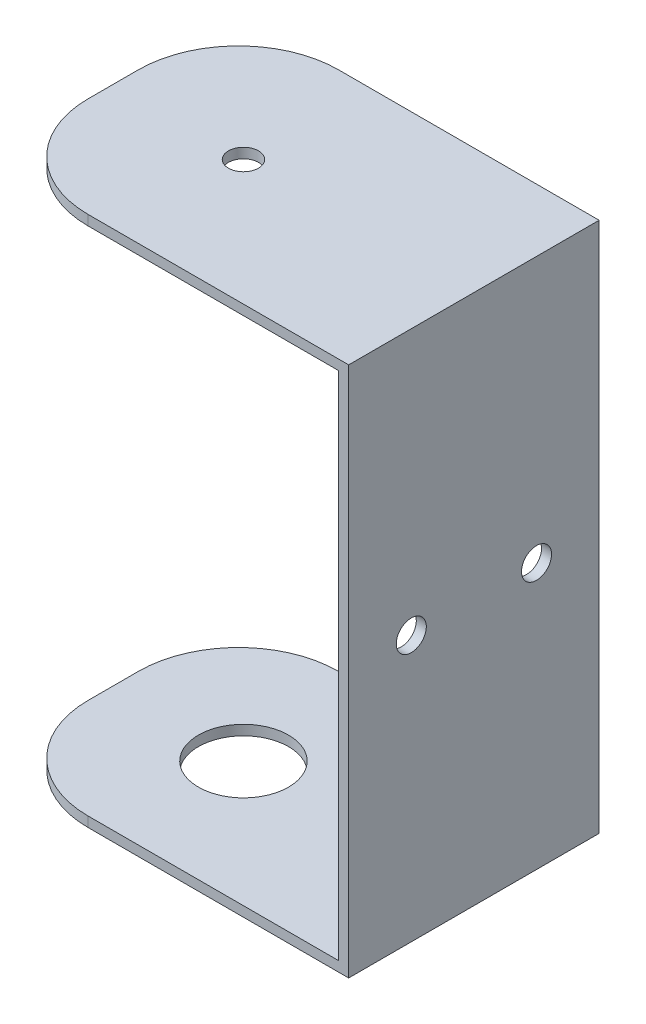
ISO-10303-21;
HEADER;
FILE_DESCRIPTION(('STEP AP214'),'2;1');
FILE_NAME('part.step','',(''),(''),'','','');
FILE_SCHEMA(('AUTOMOTIVE_DESIGN { 1 0 10303 214 1 1 1 1 }'));
ENDSEC;
DATA;
#1=APPLICATION_CONTEXT('core data for automotive mechanical design processes');
#2=APPLICATION_PROTOCOL_DEFINITION('international standard','automotive_design',2000,#1);
#3=PRODUCT_CONTEXT('',#1,'mechanical');
#4=PRODUCT('Part','Part','',(#3));
#5=PRODUCT_RELATED_PRODUCT_CATEGORY('part','',(#4));
#6=PRODUCT_DEFINITION_FORMATION('','',#4);
#7=PRODUCT_DEFINITION_CONTEXT('part definition',#1,'design');
#8=PRODUCT_DEFINITION('design','',#6,#7);
#9=PRODUCT_DEFINITION_SHAPE('','',#8);
#10=(LENGTH_UNIT() NAMED_UNIT(*) SI_UNIT(.MILLI.,.METRE.));
#11=(NAMED_UNIT(*) PLANE_ANGLE_UNIT() SI_UNIT($,.RADIAN.));
#12=(NAMED_UNIT(*) SI_UNIT($,.STERADIAN.) SOLID_ANGLE_UNIT());
#13=UNCERTAINTY_MEASURE_WITH_UNIT(LENGTH_MEASURE(1.E-05),#10,'distance_accuracy_value','');
#14=(GEOMETRIC_REPRESENTATION_CONTEXT(3) GLOBAL_UNCERTAINTY_ASSIGNED_CONTEXT((#13)) GLOBAL_UNIT_ASSIGNED_CONTEXT((#10,
#11,#12)) REPRESENTATION_CONTEXT('',''));
#15=CARTESIAN_POINT('',(0.,0.,0.));
#16=DIRECTION('',(0.,0.,1.));
#17=DIRECTION('',(1.,0.,0.));
#18=AXIS2_PLACEMENT_3D('',#15,#16,#17);
#19=CARTESIAN_POINT('',(0.,16.1492832575977,25.));
#20=DIRECTION('',(0.,-1.,0.));
#21=DIRECTION('',(1.,0.,0.));
#22=AXIS2_PLACEMENT_3D('',#19,#20,#21);
#23=PLANE('',#22);
#24=CARTESIAN_POINT('',(-22.,16.1492832575977,12.5));
#25=DIRECTION('',(0.,1.,0.));
#26=DIRECTION('',(-1.,0.,0.));
#27=AXIS2_PLACEMENT_3D('',#24,#25,#26);
#28=CIRCLE('',#27,1.5);
#29=CARTESIAN_POINT('',(-23.5,16.1492832575977,12.5));
#30=VERTEX_POINT('',#29);
#31=EDGE_CURVE('E272',#30,#30,#28,.T.);
#32=ORIENTED_EDGE('',*,*,#31,.F.);
#33=EDGE_LOOP('',(#32));
#34=FACE_BOUND('',#33,.T.);
#35=DIRECTION('',(0.,0.,-1.));
#36=VECTOR('',#35,1.);
#37=CARTESIAN_POINT('',(-35.,16.1492832575977,25.));
#38=LINE('',#37,#36);
#39=CARTESIAN_POINT('',(-35.,16.1492832575977,15.));
#40=VERTEX_POINT('',#39);
#41=CARTESIAN_POINT('',(-35.,16.1492832575977,10.));
#42=VERTEX_POINT('',#41);
#43=EDGE_CURVE('E183',#40,#42,#38,.T.);
#44=ORIENTED_EDGE('',*,*,#43,.F.);
#45=CARTESIAN_POINT('',(-25.,16.1492832575977,15.));
#46=DIRECTION('',(0.,-1.,0.));
#47=DIRECTION('',(1.,0.,0.));
#48=AXIS2_PLACEMENT_3D('',#45,#46,#47);
#49=CIRCLE('',#48,10.);
#50=CARTESIAN_POINT('',(-25.,16.1492832575977,25.));
#51=VERTEX_POINT('',#50);
#52=EDGE_CURVE('E193',#40,#51,#49,.F.);
#53=ORIENTED_EDGE('',*,*,#52,.T.);
#54=DIRECTION('',(-1.,0.,0.));
#55=VECTOR('',#54,1.);
#56=CARTESIAN_POINT('',(0.,16.1492832575977,25.));
#57=LINE('',#56,#55);
#58=CARTESIAN_POINT('',(1.,16.1492832575977,25.));
#59=VERTEX_POINT('',#58);
#60=EDGE_CURVE('E143',#59,#51,#57,.T.);
#61=ORIENTED_EDGE('',*,*,#60,.F.);
#62=DIRECTION('',(0.,0.,-1.));
#63=VECTOR('',#62,1.);
#64=CARTESIAN_POINT('',(1.,16.1492832575977,25.));
#65=LINE('',#64,#63);
#66=CARTESIAN_POINT('',(1.,16.1492832575977,0.));
#67=VERTEX_POINT('',#66);
#68=EDGE_CURVE('E157',#59,#67,#65,.T.);
#69=ORIENTED_EDGE('',*,*,#68,.T.);
#70=DIRECTION('',(-1.,0.,0.));
#71=VECTOR('',#70,1.);
#72=CARTESIAN_POINT('',(0.,16.1492832575977,0.));
#73=LINE('',#72,#71);
#74=CARTESIAN_POINT('',(-25.,16.1492832575977,0.));
#75=VERTEX_POINT('',#74);
#76=EDGE_CURVE('E158',#67,#75,#73,.T.);
#77=ORIENTED_EDGE('',*,*,#76,.T.);
#78=CARTESIAN_POINT('',(-25.,16.1492832575977,10.));
#79=DIRECTION('',(0.,-1.,0.));
#80=DIRECTION('',(1.,0.,0.));
#81=AXIS2_PLACEMENT_3D('',#78,#79,#80);
#82=CIRCLE('',#81,10.);
#83=EDGE_CURVE('E191',#75,#42,#82,.F.);
#84=ORIENTED_EDGE('',*,*,#83,.T.);
#85=EDGE_LOOP('',(#44,#53,#61,#69,#77,#84));
#86=FACE_BOUND('',#85,.T.);
#87=ADVANCED_FACE('F32',(#34,#86),#23,.F.);
#88=CARTESIAN_POINT('',(-35.,15.1492832575977,25.));
#89=DIRECTION('',(-1.,0.,0.));
#90=DIRECTION('',(0.,0.,1.));
#91=AXIS2_PLACEMENT_3D('',#88,#89,#90);
#92=PLANE('',#91);
#93=DIRECTION('',(0.,0.,-1.));
#94=VECTOR('',#93,1.);
#95=CARTESIAN_POINT('',(-35.,15.1492832575977,25.));
#96=LINE('',#95,#94);
#97=CARTESIAN_POINT('',(-35.,15.1492832575977,15.));
#98=VERTEX_POINT('',#97);
#99=CARTESIAN_POINT('',(-35.,15.1492832575977,10.));
#100=VERTEX_POINT('',#99);
#101=EDGE_CURVE('E132',#98,#100,#96,.T.);
#102=ORIENTED_EDGE('',*,*,#101,.F.);
#103=DIRECTION('',(0.,1.,0.));
#104=VECTOR('',#103,1.);
#105=CARTESIAN_POINT('',(-35.,16.1492832575977,15.));
#106=LINE('',#105,#104);
#107=EDGE_CURVE('E188',#98,#40,#106,.T.);
#108=ORIENTED_EDGE('',*,*,#107,.T.);
#109=ORIENTED_EDGE('',*,*,#43,.T.);
#110=DIRECTION('',(0.,1.,0.));
#111=VECTOR('',#110,1.);
#112=CARTESIAN_POINT('',(-35.,15.1492832575977,10.));
#113=LINE('',#112,#111);
#114=EDGE_CURVE('E186',#42,#100,#113,.F.);
#115=ORIENTED_EDGE('',*,*,#114,.T.);
#116=EDGE_LOOP('',(#102,#108,#109,#115));
#117=FACE_BOUND('',#116,.T.);
#118=ADVANCED_FACE('F245',(#117),#92,.T.);
#119=CARTESIAN_POINT('',(0.,15.1492832575977,25.));
#120=DIRECTION('',(0.,-1.,0.));
#121=DIRECTION('',(1.,0.,0.));
#122=AXIS2_PLACEMENT_3D('',#119,#120,#121);
#123=PLANE('',#122);
#124=CARTESIAN_POINT('',(-22.,15.1492832575977,12.5));
#125=DIRECTION('',(0.,1.,0.));
#126=DIRECTION('',(-1.,0.,0.));
#127=AXIS2_PLACEMENT_3D('',#124,#125,#126);
#128=CIRCLE('',#127,1.5);
#129=CARTESIAN_POINT('',(-23.5,15.1492832575977,12.5));
#130=VERTEX_POINT('',#129);
#131=EDGE_CURVE('E161',#130,#130,#128,.T.);
#132=ORIENTED_EDGE('',*,*,#131,.T.);
#133=EDGE_LOOP('',(#132));
#134=FACE_BOUND('',#133,.T.);
#135=DIRECTION('',(-1.,0.,0.));
#136=VECTOR('',#135,1.);
#137=CARTESIAN_POINT('',(0.,15.1492832575977,25.));
#138=LINE('',#137,#136);
#139=CARTESIAN_POINT('',(0.,15.1492832575977,25.));
#140=VERTEX_POINT('',#139);
#141=CARTESIAN_POINT('',(-25.,15.1492832575977,25.));
#142=VERTEX_POINT('',#141);
#143=EDGE_CURVE('E124',#140,#142,#138,.T.);
#144=ORIENTED_EDGE('',*,*,#143,.T.);
#145=CARTESIAN_POINT('',(-25.,15.1492832575977,15.));
#146=DIRECTION('',(0.,-1.,0.));
#147=DIRECTION('',(1.,0.,0.));
#148=AXIS2_PLACEMENT_3D('',#145,#146,#147);
#149=CIRCLE('',#148,10.);
#150=EDGE_CURVE('E200',#142,#98,#149,.T.);
#151=ORIENTED_EDGE('',*,*,#150,.T.);
#152=ORIENTED_EDGE('',*,*,#101,.T.);
#153=CARTESIAN_POINT('',(-25.,15.1492832575977,10.));
#154=DIRECTION('',(0.,-1.,0.));
#155=DIRECTION('',(1.,0.,0.));
#156=AXIS2_PLACEMENT_3D('',#153,#154,#155);
#157=CIRCLE('',#156,10.);
#158=CARTESIAN_POINT('',(-25.,15.1492832575977,0.));
#159=VERTEX_POINT('',#158);
#160=EDGE_CURVE('E198',#100,#159,#157,.T.);
#161=ORIENTED_EDGE('',*,*,#160,.T.);
#162=DIRECTION('',(-1.,0.,0.));
#163=VECTOR('',#162,1.);
#164=CARTESIAN_POINT('',(0.,15.1492832575977,0.));
#165=LINE('',#164,#163);
#166=CARTESIAN_POINT('',(0.,15.1492832575977,0.));
#167=VERTEX_POINT('',#166);
#168=EDGE_CURVE('E127',#167,#159,#165,.T.);
#169=ORIENTED_EDGE('',*,*,#168,.F.);
#170=DIRECTION('',(0.,0.,-1.));
#171=VECTOR('',#170,1.);
#172=CARTESIAN_POINT('',(0.,15.1492832575977,25.));
#173=LINE('',#172,#171);
#174=EDGE_CURVE('E121',#140,#167,#173,.T.);
#175=ORIENTED_EDGE('',*,*,#174,.F.);
#176=EDGE_LOOP('',(#144,#151,#152,#161,#169,#175));
#177=FACE_BOUND('',#176,.T.);
#178=ADVANCED_FACE('F123',(#134,#177),#123,.T.);
#179=CARTESIAN_POINT('',(0.,15.1492832575977,25.));
#180=DIRECTION('',(-1.,0.,0.));
#181=DIRECTION('',(0.,-1.,0.));
#182=AXIS2_PLACEMENT_3D('',#179,#180,#181);
#183=PLANE('',#182);
#184=CARTESIAN_POINT('',(0.,-10.3507167424023,18.75));
#185=DIRECTION('',(1.,0.,0.));
#186=DIRECTION('',(0.,1.,0.));
#187=AXIS2_PLACEMENT_3D('',#184,#185,#186);
#188=CIRCLE('',#187,1.5);
#189=CARTESIAN_POINT('',(0.,-8.85071674240226,18.75));
#190=VERTEX_POINT('',#189);
#191=EDGE_CURVE('E287',#190,#190,#188,.T.);
#192=ORIENTED_EDGE('',*,*,#191,.T.);
#193=EDGE_LOOP('',(#192));
#194=FACE_BOUND('',#193,.T.);
#195=CARTESIAN_POINT('',(0.,-10.3507167424023,6.25));
#196=DIRECTION('',(1.,0.,0.));
#197=DIRECTION('',(0.,1.,0.));
#198=AXIS2_PLACEMENT_3D('',#195,#196,#197);
#199=CIRCLE('',#198,1.5);
#200=CARTESIAN_POINT('',(0.,-8.85071674240226,6.25));
#201=VERTEX_POINT('',#200);
#202=EDGE_CURVE('E281',#201,#201,#199,.T.);
#203=ORIENTED_EDGE('',*,*,#202,.T.);
#204=EDGE_LOOP('',(#203));
#205=FACE_BOUND('',#204,.T.);
#206=DIRECTION('',(0.,1.,0.));
#207=VECTOR('',#206,1.);
#208=CARTESIAN_POINT('',(0.,15.1492832575977,0.));
#209=LINE('',#208,#207);
#210=CARTESIAN_POINT('',(0.,-35.8507167424023,0.));
#211=VERTEX_POINT('',#210);
#212=EDGE_CURVE('E163',#211,#167,#209,.T.);
#213=ORIENTED_EDGE('',*,*,#212,.F.);
#214=DIRECTION('',(0.,0.,-1.));
#215=VECTOR('',#214,1.);
#216=CARTESIAN_POINT('',(0.,-35.8507167424023,25.));
#217=LINE('',#216,#215);
#218=CARTESIAN_POINT('',(0.,-35.8507167424023,25.));
#219=VERTEX_POINT('',#218);
#220=EDGE_CURVE('E133',#219,#211,#217,.T.);
#221=ORIENTED_EDGE('',*,*,#220,.F.);
#222=DIRECTION('',(0.,1.,0.));
#223=VECTOR('',#222,1.);
#224=CARTESIAN_POINT('',(0.,15.1492832575977,25.));
#225=LINE('',#224,#223);
#226=EDGE_CURVE('E140',#219,#140,#225,.T.);
#227=ORIENTED_EDGE('',*,*,#226,.T.);
#228=ORIENTED_EDGE('',*,*,#174,.T.);
#229=EDGE_LOOP('',(#213,#221,#227,#228));
#230=FACE_BOUND('',#229,.T.);
#231=ADVANCED_FACE('F146',(#194,#205,#230),#183,.T.);
#232=CARTESIAN_POINT('',(0.,-35.8507167424023,25.));
#233=DIRECTION('',(0.,1.,0.));
#234=DIRECTION('',(-1.,0.,0.));
#235=AXIS2_PLACEMENT_3D('',#232,#233,#234);
#236=PLANE('',#235);
#237=CARTESIAN_POINT('',(-22.,-35.8507167424023,12.5));
#238=DIRECTION('',(0.,-1.,0.));
#239=DIRECTION('',(1.,0.,0.));
#240=AXIS2_PLACEMENT_3D('',#237,#238,#239);
#241=CIRCLE('',#240,4.5);
#242=CARTESIAN_POINT('',(-17.5,-35.8507167424023,12.5));
#243=VERTEX_POINT('',#242);
#244=EDGE_CURVE('E275',#243,#243,#241,.T.);
#245=ORIENTED_EDGE('',*,*,#244,.T.);
#246=EDGE_LOOP('',(#245));
#247=FACE_BOUND('',#246,.T.);
#248=DIRECTION('',(1.,0.,0.));
#249=VECTOR('',#248,1.);
#250=CARTESIAN_POINT('',(0.,-35.8507167424023,0.));
#251=LINE('',#250,#249);
#252=CARTESIAN_POINT('',(-25.,-35.8507167424023,0.));
#253=VERTEX_POINT('',#252);
#254=EDGE_CURVE('E165',#253,#211,#251,.T.);
#255=ORIENTED_EDGE('',*,*,#254,.F.);
#256=CARTESIAN_POINT('',(-25.,-35.8507167424023,10.));
#257=DIRECTION('',(0.,1.,0.));
#258=DIRECTION('',(-1.,0.,0.));
#259=AXIS2_PLACEMENT_3D('',#256,#257,#258);
#260=CIRCLE('',#259,10.);
#261=CARTESIAN_POINT('',(-35.,-35.8507167424023,10.));
#262=VERTEX_POINT('',#261);
#263=EDGE_CURVE('E210',#253,#262,#260,.T.);
#264=ORIENTED_EDGE('',*,*,#263,.T.);
#265=DIRECTION('',(0.,0.,-1.));
#266=VECTOR('',#265,1.);
#267=CARTESIAN_POINT('',(-35.,-35.8507167424023,25.));
#268=LINE('',#267,#266);
#269=CARTESIAN_POINT('',(-35.,-35.8507167424023,15.));
#270=VERTEX_POINT('',#269);
#271=EDGE_CURVE('E178',#270,#262,#268,.T.);
#272=ORIENTED_EDGE('',*,*,#271,.F.);
#273=CARTESIAN_POINT('',(-25.,-35.8507167424023,15.));
#274=DIRECTION('',(0.,1.,0.));
#275=DIRECTION('',(-1.,0.,0.));
#276=AXIS2_PLACEMENT_3D('',#273,#274,#275);
#277=CIRCLE('',#276,10.);
#278=CARTESIAN_POINT('',(-25.,-35.8507167424023,25.));
#279=VERTEX_POINT('',#278);
#280=EDGE_CURVE('E208',#270,#279,#277,.T.);
#281=ORIENTED_EDGE('',*,*,#280,.T.);
#282=DIRECTION('',(1.,0.,0.));
#283=VECTOR('',#282,1.);
#284=CARTESIAN_POINT('',(0.,-35.8507167424023,25.));
#285=LINE('',#284,#283);
#286=EDGE_CURVE('E148',#279,#219,#285,.T.);
#287=ORIENTED_EDGE('',*,*,#286,.T.);
#288=ORIENTED_EDGE('',*,*,#220,.T.);
#289=EDGE_LOOP('',(#255,#264,#272,#281,#287,#288));
#290=FACE_BOUND('',#289,.T.);
#291=ADVANCED_FACE('F221',(#247,#290),#236,.T.);
#292=CARTESIAN_POINT('',(-35.,-36.8507167424023,25.));
#293=DIRECTION('',(-1.,0.,0.));
#294=DIRECTION('',(0.,0.,1.));
#295=AXIS2_PLACEMENT_3D('',#292,#293,#294);
#296=PLANE('',#295);
#297=ORIENTED_EDGE('',*,*,#271,.T.);
#298=DIRECTION('',(0.,1.,0.));
#299=VECTOR('',#298,1.);
#300=CARTESIAN_POINT('',(-35.,-36.8507167424023,10.));
#301=LINE('',#300,#299);
#302=CARTESIAN_POINT('',(-35.,-36.8507167424023,10.));
#303=VERTEX_POINT('',#302);
#304=EDGE_CURVE('E47',#262,#303,#301,.F.);
#305=ORIENTED_EDGE('',*,*,#304,.T.);
#306=DIRECTION('',(0.,0.,-1.));
#307=VECTOR('',#306,1.);
#308=CARTESIAN_POINT('',(-35.,-36.8507167424023,25.));
#309=LINE('',#308,#307);
#310=CARTESIAN_POINT('',(-35.,-36.8507167424023,15.));
#311=VERTEX_POINT('',#310);
#312=EDGE_CURVE('E176',#311,#303,#309,.T.);
#313=ORIENTED_EDGE('',*,*,#312,.F.);
#314=DIRECTION('',(0.,1.,0.));
#315=VECTOR('',#314,1.);
#316=CARTESIAN_POINT('',(-35.,-35.8507167424023,15.));
#317=LINE('',#316,#315);
#318=EDGE_CURVE('E212',#311,#270,#317,.T.);
#319=ORIENTED_EDGE('',*,*,#318,.T.);
#320=EDGE_LOOP('',(#297,#305,#313,#319));
#321=FACE_BOUND('',#320,.T.);
#322=ADVANCED_FACE('F217',(#321),#296,.T.);
#323=CARTESIAN_POINT('',(0.,-36.8507167424023,25.));
#324=DIRECTION('',(0.,1.,0.));
#325=DIRECTION('',(-1.,0.,0.));
#326=AXIS2_PLACEMENT_3D('',#323,#324,#325);
#327=PLANE('',#326);
#328=CARTESIAN_POINT('',(-22.,-36.8507167424023,12.5));
#329=DIRECTION('',(0.,-1.,0.));
#330=DIRECTION('',(1.,0.,0.));
#331=AXIS2_PLACEMENT_3D('',#328,#329,#330);
#332=CIRCLE('',#331,4.5);
#333=CARTESIAN_POINT('',(-17.5,-36.8507167424023,12.5));
#334=VERTEX_POINT('',#333);
#335=EDGE_CURVE('E278',#334,#334,#332,.T.);
#336=ORIENTED_EDGE('',*,*,#335,.F.);
#337=EDGE_LOOP('',(#336));
#338=FACE_BOUND('',#337,.T.);
#339=ORIENTED_EDGE('',*,*,#312,.T.);
#340=CARTESIAN_POINT('',(-25.,-36.8507167424023,10.));
#341=DIRECTION('',(0.,1.,0.));
#342=DIRECTION('',(-1.,0.,0.));
#343=AXIS2_PLACEMENT_3D('',#340,#341,#342);
#344=CIRCLE('',#343,10.);
#345=CARTESIAN_POINT('',(-25.,-36.8507167424023,0.));
#346=VERTEX_POINT('',#345);
#347=EDGE_CURVE('E11',#303,#346,#344,.F.);
#348=ORIENTED_EDGE('',*,*,#347,.T.);
#349=DIRECTION('',(1.,0.,0.));
#350=VECTOR('',#349,1.);
#351=CARTESIAN_POINT('',(0.,-36.8507167424023,0.));
#352=LINE('',#351,#350);
#353=CARTESIAN_POINT('',(1.,-36.8507167424023,0.));
#354=VERTEX_POINT('',#353);
#355=EDGE_CURVE('E167',#346,#354,#352,.T.);
#356=ORIENTED_EDGE('',*,*,#355,.T.);
#357=DIRECTION('',(0.,0.,-1.));
#358=VECTOR('',#357,1.);
#359=CARTESIAN_POINT('',(1.,-36.8507167424023,25.));
#360=LINE('',#359,#358);
#361=CARTESIAN_POINT('',(1.,-36.8507167424023,25.));
#362=VERTEX_POINT('',#361);
#363=EDGE_CURVE('E173',#362,#354,#360,.T.);
#364=ORIENTED_EDGE('',*,*,#363,.F.);
#365=DIRECTION('',(1.,0.,0.));
#366=VECTOR('',#365,1.);
#367=CARTESIAN_POINT('',(0.,-36.8507167424023,25.));
#368=LINE('',#367,#366);
#369=CARTESIAN_POINT('',(-25.,-36.8507167424023,25.));
#370=VERTEX_POINT('',#369);
#371=EDGE_CURVE('E150',#370,#362,#368,.T.);
#372=ORIENTED_EDGE('',*,*,#371,.F.);
#373=CARTESIAN_POINT('',(-25.,-36.8507167424023,15.));
#374=DIRECTION('',(0.,1.,0.));
#375=DIRECTION('',(-1.,0.,0.));
#376=AXIS2_PLACEMENT_3D('',#373,#374,#375);
#377=CIRCLE('',#376,10.);
#378=EDGE_CURVE('E40',#370,#311,#377,.F.);
#379=ORIENTED_EDGE('',*,*,#378,.T.);
#380=EDGE_LOOP('',(#339,#348,#356,#364,#372,#379));
#381=FACE_BOUND('',#380,.T.);
#382=ADVANCED_FACE('F232',(#338,#381),#327,.F.);
#383=CARTESIAN_POINT('',(1.,15.1492832575977,25.));
#384=DIRECTION('',(-1.,0.,0.));
#385=DIRECTION('',(0.,-1.,0.));
#386=AXIS2_PLACEMENT_3D('',#383,#384,#385);
#387=PLANE('',#386);
#388=CARTESIAN_POINT('',(1.,-10.3507167424023,18.75));
#389=DIRECTION('',(1.,0.,0.));
#390=DIRECTION('',(0.,1.,0.));
#391=AXIS2_PLACEMENT_3D('',#388,#389,#390);
#392=CIRCLE('',#391,1.5);
#393=CARTESIAN_POINT('',(1.,-8.85071674240226,18.75));
#394=VERTEX_POINT('',#393);
#395=EDGE_CURVE('E290',#394,#394,#392,.T.);
#396=ORIENTED_EDGE('',*,*,#395,.F.);
#397=EDGE_LOOP('',(#396));
#398=FACE_BOUND('',#397,.T.);
#399=CARTESIAN_POINT('',(1.,-10.3507167424023,6.25));
#400=DIRECTION('',(1.,0.,0.));
#401=DIRECTION('',(0.,1.,0.));
#402=AXIS2_PLACEMENT_3D('',#399,#400,#401);
#403=CIRCLE('',#402,1.5);
#404=CARTESIAN_POINT('',(1.,-8.85071674240226,6.25));
#405=VERTEX_POINT('',#404);
#406=EDGE_CURVE('E284',#405,#405,#403,.T.);
#407=ORIENTED_EDGE('',*,*,#406,.F.);
#408=EDGE_LOOP('',(#407));
#409=FACE_BOUND('',#408,.T.);
#410=DIRECTION('',(0.,1.,0.));
#411=VECTOR('',#410,1.);
#412=CARTESIAN_POINT('',(1.,15.1492832575977,0.));
#413=LINE('',#412,#411);
#414=EDGE_CURVE('E169',#354,#67,#413,.T.);
#415=ORIENTED_EDGE('',*,*,#414,.T.);
#416=ORIENTED_EDGE('',*,*,#68,.F.);
#417=DIRECTION('',(0.,1.,0.));
#418=VECTOR('',#417,1.);
#419=CARTESIAN_POINT('',(1.,15.1492832575977,25.));
#420=LINE('',#419,#418);
#421=EDGE_CURVE('E155',#362,#59,#420,.T.);
#422=ORIENTED_EDGE('',*,*,#421,.F.);
#423=ORIENTED_EDGE('',*,*,#363,.T.);
#424=EDGE_LOOP('',(#415,#416,#422,#423));
#425=FACE_BOUND('',#424,.T.);
#426=ADVANCED_FACE('F235',(#398,#409,#425),#387,.F.);
#427=CARTESIAN_POINT('',(0.,0.,25.));
#428=DIRECTION('',(0.,0.,-1.));
#429=DIRECTION('',(-1.,0.,0.));
#430=AXIS2_PLACEMENT_3D('',#427,#428,#429);
#431=PLANE('',#430);
#432=ORIENTED_EDGE('',*,*,#60,.T.);
#433=DIRECTION('',(0.,1.,0.));
#434=VECTOR('',#433,1.);
#435=CARTESIAN_POINT('',(-25.,15.1492832575977,25.));
#436=LINE('',#435,#434);
#437=EDGE_CURVE('E142',#51,#142,#436,.F.);
#438=ORIENTED_EDGE('',*,*,#437,.T.);
#439=ORIENTED_EDGE('',*,*,#143,.F.);
#440=ORIENTED_EDGE('',*,*,#226,.F.);
#441=ORIENTED_EDGE('',*,*,#286,.F.);
#442=DIRECTION('',(0.,1.,0.));
#443=VECTOR('',#442,1.);
#444=CARTESIAN_POINT('',(-25.,-36.8507167424023,25.));
#445=LINE('',#444,#443);
#446=EDGE_CURVE('E195',#279,#370,#445,.F.);
#447=ORIENTED_EDGE('',*,*,#446,.T.);
#448=ORIENTED_EDGE('',*,*,#371,.T.);
#449=ORIENTED_EDGE('',*,*,#421,.T.);
#450=EDGE_LOOP('',(#432,#438,#439,#440,#441,#447,#448,#449));
#451=FACE_BOUND('',#450,.T.);
#452=ADVANCED_FACE('F138',(#451),#431,.F.);
#453=CARTESIAN_POINT('',(0.,0.,0.));
#454=DIRECTION('',(0.,0.,-1.));
#455=DIRECTION('',(-1.,0.,0.));
#456=AXIS2_PLACEMENT_3D('',#453,#454,#455);
#457=PLANE('',#456);
#458=ORIENTED_EDGE('',*,*,#168,.T.);
#459=DIRECTION('',(0.,1.,0.));
#460=VECTOR('',#459,1.);
#461=CARTESIAN_POINT('',(-25.,0.,0.));
#462=LINE('',#461,#460);
#463=EDGE_CURVE('E205',#159,#75,#462,.T.);
#464=ORIENTED_EDGE('',*,*,#463,.T.);
#465=ORIENTED_EDGE('',*,*,#76,.F.);
#466=ORIENTED_EDGE('',*,*,#414,.F.);
#467=ORIENTED_EDGE('',*,*,#355,.F.);
#468=DIRECTION('',(0.,1.,0.));
#469=VECTOR('',#468,1.);
#470=CARTESIAN_POINT('',(-25.,0.,0.));
#471=LINE('',#470,#469);
#472=EDGE_CURVE('E202',#346,#253,#471,.T.);
#473=ORIENTED_EDGE('',*,*,#472,.T.);
#474=ORIENTED_EDGE('',*,*,#254,.T.);
#475=ORIENTED_EDGE('',*,*,#212,.T.);
#476=EDGE_LOOP('',(#458,#464,#465,#466,#467,#473,#474,#475));
#477=FACE_BOUND('',#476,.T.);
#478=ADVANCED_FACE('F228',(#477),#457,.T.);
#479=CARTESIAN_POINT('',(-22.,15.1492832575977,12.5));
#480=DIRECTION('',(0.,1.,0.));
#481=DIRECTION('',(-1.,0.,0.));
#482=AXIS2_PLACEMENT_3D('',#479,#480,#481);
#483=CYLINDRICAL_SURFACE('',#482,1.5);
#484=ORIENTED_EDGE('',*,*,#131,.F.);
#485=EDGE_LOOP('',(#484));
#486=FACE_BOUND('',#485,.T.);
#487=ORIENTED_EDGE('',*,*,#31,.T.);
#488=EDGE_LOOP('',(#487));
#489=FACE_BOUND('',#488,.T.);
#490=ADVANCED_FACE('F316',(#486,#489),#483,.F.);
#491=CARTESIAN_POINT('',(-22.,-35.8507167424023,12.5));
#492=DIRECTION('',(0.,-1.,0.));
#493=DIRECTION('',(1.,0.,0.));
#494=AXIS2_PLACEMENT_3D('',#491,#492,#493);
#495=CYLINDRICAL_SURFACE('',#494,4.5);
#496=ORIENTED_EDGE('',*,*,#244,.F.);
#497=EDGE_LOOP('',(#496));
#498=FACE_BOUND('',#497,.T.);
#499=ORIENTED_EDGE('',*,*,#335,.T.);
#500=EDGE_LOOP('',(#499));
#501=FACE_BOUND('',#500,.T.);
#502=ADVANCED_FACE('F310',(#498,#501),#495,.F.);
#503=CARTESIAN_POINT('',(0.,-10.3507167424023,6.25));
#504=DIRECTION('',(1.,0.,0.));
#505=DIRECTION('',(0.,1.,0.));
#506=AXIS2_PLACEMENT_3D('',#503,#504,#505);
#507=CYLINDRICAL_SURFACE('',#506,1.5);
#508=ORIENTED_EDGE('',*,*,#202,.F.);
#509=EDGE_LOOP('',(#508));
#510=FACE_BOUND('',#509,.T.);
#511=ORIENTED_EDGE('',*,*,#406,.T.);
#512=EDGE_LOOP('',(#511));
#513=FACE_BOUND('',#512,.T.);
#514=ADVANCED_FACE('F300',(#510,#513),#507,.F.);
#515=CARTESIAN_POINT('',(0.,-10.3507167424023,18.75));
#516=DIRECTION('',(1.,0.,0.));
#517=DIRECTION('',(0.,1.,0.));
#518=AXIS2_PLACEMENT_3D('',#515,#516,#517);
#519=CYLINDRICAL_SURFACE('',#518,1.5);
#520=ORIENTED_EDGE('',*,*,#191,.F.);
#521=EDGE_LOOP('',(#520));
#522=FACE_BOUND('',#521,.T.);
#523=ORIENTED_EDGE('',*,*,#395,.T.);
#524=EDGE_LOOP('',(#523));
#525=FACE_BOUND('',#524,.T.);
#526=ADVANCED_FACE('F260',(#522,#525),#519,.F.);
#527=CARTESIAN_POINT('',(-25.,15.1492832575977,15.));
#528=DIRECTION('',(0.,-1.,0.));
#529=DIRECTION('',(0.,0.,-1.));
#530=AXIS2_PLACEMENT_3D('',#527,#528,#529);
#531=CYLINDRICAL_SURFACE('',#530,10.);
#532=ORIENTED_EDGE('',*,*,#150,.F.);
#533=ORIENTED_EDGE('',*,*,#437,.F.);
#534=ORIENTED_EDGE('',*,*,#52,.F.);
#535=ORIENTED_EDGE('',*,*,#107,.F.);
#536=EDGE_LOOP('',(#532,#533,#534,#535));
#537=FACE_BOUND('',#536,.T.);
#538=ADVANCED_FACE('F257',(#537),#531,.T.);
#539=CARTESIAN_POINT('',(-25.,0.,10.));
#540=DIRECTION('',(0.,1.,0.));
#541=DIRECTION('',(0.,0.,1.));
#542=AXIS2_PLACEMENT_3D('',#539,#540,#541);
#543=CYLINDRICAL_SURFACE('',#542,10.);
#544=ORIENTED_EDGE('',*,*,#160,.F.);
#545=ORIENTED_EDGE('',*,*,#114,.F.);
#546=ORIENTED_EDGE('',*,*,#83,.F.);
#547=ORIENTED_EDGE('',*,*,#463,.F.);
#548=EDGE_LOOP('',(#544,#545,#546,#547));
#549=FACE_BOUND('',#548,.T.);
#550=ADVANCED_FACE('F243',(#549),#543,.T.);
#551=CARTESIAN_POINT('',(-25.,0.,10.));
#552=DIRECTION('',(0.,1.,0.));
#553=DIRECTION('',(0.,0.,1.));
#554=AXIS2_PLACEMENT_3D('',#551,#552,#553);
#555=CYLINDRICAL_SURFACE('',#554,10.);
#556=ORIENTED_EDGE('',*,*,#347,.F.);
#557=ORIENTED_EDGE('',*,*,#304,.F.);
#558=ORIENTED_EDGE('',*,*,#263,.F.);
#559=ORIENTED_EDGE('',*,*,#472,.F.);
#560=EDGE_LOOP('',(#556,#557,#558,#559));
#561=FACE_BOUND('',#560,.T.);
#562=ADVANCED_FACE('F225',(#561),#555,.T.);
#563=CARTESIAN_POINT('',(-25.,-36.8507167424023,15.));
#564=DIRECTION('',(0.,-1.,0.));
#565=DIRECTION('',(0.,0.,-1.));
#566=AXIS2_PLACEMENT_3D('',#563,#564,#565);
#567=CYLINDRICAL_SURFACE('',#566,10.);
#568=ORIENTED_EDGE('',*,*,#378,.F.);
#569=ORIENTED_EDGE('',*,*,#446,.F.);
#570=ORIENTED_EDGE('',*,*,#280,.F.);
#571=ORIENTED_EDGE('',*,*,#318,.F.);
#572=EDGE_LOOP('',(#568,#569,#570,#571));
#573=FACE_BOUND('',#572,.T.);
#574=ADVANCED_FACE('F34',(#573),#567,.T.);
#575=CLOSED_SHELL('',(#87,#118,#178,#231,#291,#322,#382,#426,#452,#478,#490,#502,#514,#526,#538,
#550,#562,#574));
#576=MANIFOLD_SOLID_BREP('B2',#575);
#577=ADVANCED_BREP_SHAPE_REPRESENTATION('',(#18,#576),#14);
#578=SHAPE_DEFINITION_REPRESENTATION(#9,#577);
ENDSEC;
END-ISO-10303-21;
